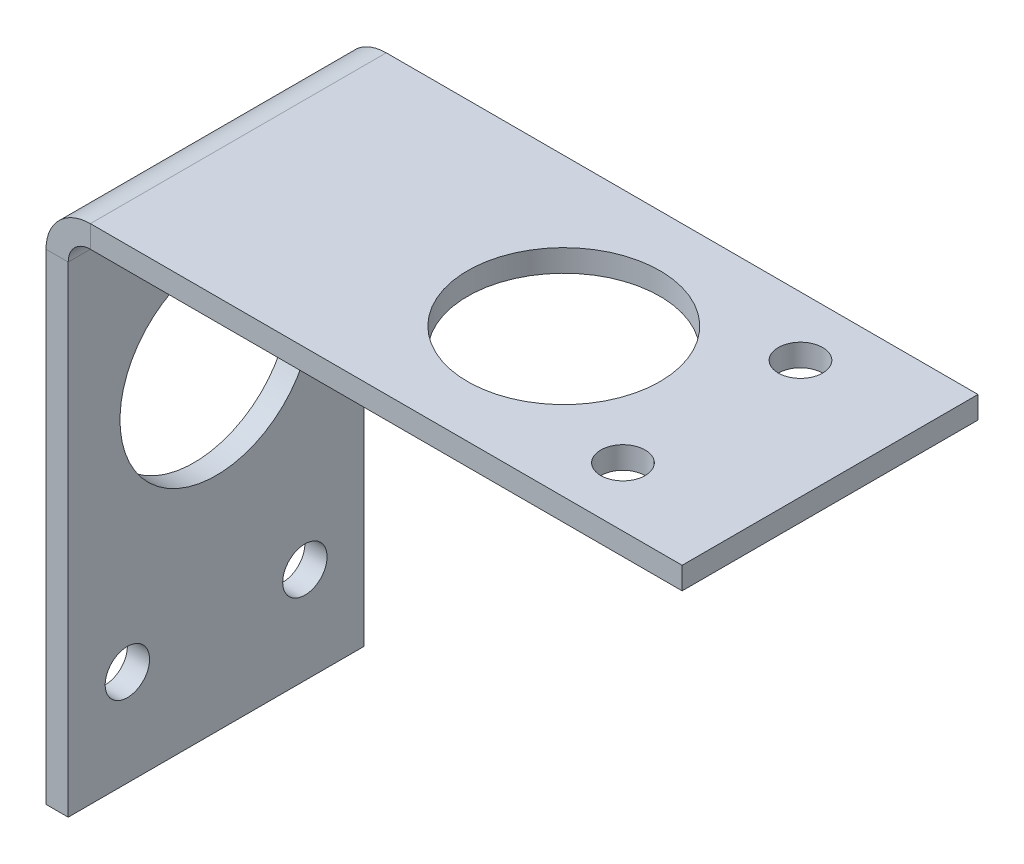
ISO-10303-21;
HEADER;
FILE_DESCRIPTION(('STEP AP214'),'2;1');
FILE_NAME('part.step','',(''),(''),'','','');
FILE_SCHEMA(('AUTOMOTIVE_DESIGN { 1 0 10303 214 1 1 1 1 }'));
ENDSEC;
DATA;
#1=APPLICATION_CONTEXT('core data for automotive mechanical design processes');
#2=APPLICATION_PROTOCOL_DEFINITION('international standard','automotive_design',2000,#1);
#3=PRODUCT_CONTEXT('',#1,'mechanical');
#4=PRODUCT('Part','Part','',(#3));
#5=PRODUCT_RELATED_PRODUCT_CATEGORY('part','',(#4));
#6=PRODUCT_DEFINITION_FORMATION('','',#4);
#7=PRODUCT_DEFINITION_CONTEXT('part definition',#1,'design');
#8=PRODUCT_DEFINITION('design','',#6,#7);
#9=PRODUCT_DEFINITION_SHAPE('','',#8);
#10=(LENGTH_UNIT() NAMED_UNIT(*) SI_UNIT(.MILLI.,.METRE.));
#11=(NAMED_UNIT(*) PLANE_ANGLE_UNIT() SI_UNIT($,.RADIAN.));
#12=(NAMED_UNIT(*) SI_UNIT($,.STERADIAN.) SOLID_ANGLE_UNIT());
#13=UNCERTAINTY_MEASURE_WITH_UNIT(LENGTH_MEASURE(1.E-05),#10,'distance_accuracy_value','');
#14=(GEOMETRIC_REPRESENTATION_CONTEXT(3) GLOBAL_UNCERTAINTY_ASSIGNED_CONTEXT((#13)) GLOBAL_UNIT_ASSIGNED_CONTEXT((#10,
#11,#12)) REPRESENTATION_CONTEXT('',''));
#15=CARTESIAN_POINT('',(0.,0.,0.));
#16=DIRECTION('',(0.,0.,1.));
#17=DIRECTION('',(1.,0.,0.));
#18=AXIS2_PLACEMENT_3D('',#15,#16,#17);
#19=CARTESIAN_POINT('',(-83.,-3.00000000000001,40.));
#20=DIRECTION('',(0.,0.,1.));
#21=DIRECTION('',(1.,0.,0.));
#22=AXIS2_PLACEMENT_3D('',#19,#20,#21);
#23=PLANE('',#22);
#24=DIRECTION('',(-1.,0.,0.));
#25=VECTOR('',#24,1.);
#26=CARTESIAN_POINT('',(-83.,-3.00000000000001,40.));
#27=LINE('',#26,#25);
#28=CARTESIAN_POINT('',(-83.,-3.00000000000001,40.));
#29=VERTEX_POINT('',#28);
#30=CARTESIAN_POINT('',(-86.,-3.00000000000001,40.));
#31=VERTEX_POINT('',#30);
#32=EDGE_CURVE('E11',#29,#31,#27,.T.);
#33=ORIENTED_EDGE('',*,*,#32,.F.);
#34=CARTESIAN_POINT('',(-80.,-3.00000000000001,40.));
#35=DIRECTION('',(0.,0.,-1.));
#36=DIRECTION('',(-1.,0.,0.));
#37=AXIS2_PLACEMENT_3D('',#34,#35,#36);
#38=CIRCLE('',#37,3.);
#39=CARTESIAN_POINT('',(-80.,0.,40.));
#40=VERTEX_POINT('',#39);
#41=EDGE_CURVE('E148',#40,#29,#38,.F.);
#42=ORIENTED_EDGE('',*,*,#41,.F.);
#43=DIRECTION('',(0.,-1.,0.));
#44=VECTOR('',#43,1.);
#45=CARTESIAN_POINT('',(-80.,2.99999999999999,40.));
#46=LINE('',#45,#44);
#47=CARTESIAN_POINT('',(-80.,2.99999999999999,40.));
#48=VERTEX_POINT('',#47);
#49=EDGE_CURVE('E54',#48,#40,#46,.T.);
#50=ORIENTED_EDGE('',*,*,#49,.F.);
#51=CARTESIAN_POINT('',(-80.,-3.00000000000001,40.));
#52=DIRECTION('',(0.,0.,1.));
#53=DIRECTION('',(1.,0.,0.));
#54=AXIS2_PLACEMENT_3D('',#51,#52,#53);
#55=CIRCLE('',#54,6.);
#56=EDGE_CURVE('E139',#48,#31,#55,.T.);
#57=ORIENTED_EDGE('',*,*,#56,.T.);
#58=EDGE_LOOP('',(#33,#42,#50,#57));
#59=FACE_BOUND('',#58,.T.);
#60=ADVANCED_FACE('F44',(#59),#23,.T.);
#61=CARTESIAN_POINT('',(-80.,2.99999999999999,40.));
#62=DIRECTION('',(0.,0.,1.));
#63=DIRECTION('',(1.,0.,0.));
#64=AXIS2_PLACEMENT_3D('',#61,#62,#63);
#65=PLANE('',#64);
#66=DIRECTION('',(0.,-1.,0.));
#67=VECTOR('',#66,1.);
#68=CARTESIAN_POINT('',(-83.,0.,40.));
#69=LINE('',#68,#67);
#70=CARTESIAN_POINT('',(-83.,-68.,40.));
#71=VERTEX_POINT('',#70);
#72=EDGE_CURVE('E250',#29,#71,#69,.T.);
#73=ORIENTED_EDGE('',*,*,#72,.F.);
#74=ORIENTED_EDGE('',*,*,#32,.T.);
#75=DIRECTION('',(0.,-1.,0.));
#76=VECTOR('',#75,1.);
#77=CARTESIAN_POINT('',(-86.,0.,40.));
#78=LINE('',#77,#76);
#79=CARTESIAN_POINT('',(-86.,-68.,40.));
#80=VERTEX_POINT('',#79);
#81=EDGE_CURVE('E103',#31,#80,#78,.T.);
#82=ORIENTED_EDGE('',*,*,#81,.T.);
#83=DIRECTION('',(-1.,0.,0.));
#84=VECTOR('',#83,1.);
#85=CARTESIAN_POINT('',(-83.,-68.,40.));
#86=LINE('',#85,#84);
#87=EDGE_CURVE('E246',#71,#80,#86,.T.);
#88=ORIENTED_EDGE('',*,*,#87,.F.);
#89=EDGE_LOOP('',(#73,#74,#82,#88));
#90=FACE_BOUND('',#89,.T.);
#91=ADVANCED_FACE('F272',(#90),#65,.T.);
#92=CARTESIAN_POINT('',(-80.,0.,0.));
#93=DIRECTION('',(0.,0.,-1.));
#94=DIRECTION('',(-1.,0.,0.));
#95=AXIS2_PLACEMENT_3D('',#92,#93,#94);
#96=PLANE('',#95);
#97=DIRECTION('',(0.,1.,0.));
#98=VECTOR('',#97,1.);
#99=CARTESIAN_POINT('',(-80.,0.,0.));
#100=LINE('',#99,#98);
#101=CARTESIAN_POINT('',(-80.,0.,0.));
#102=VERTEX_POINT('',#101);
#103=CARTESIAN_POINT('',(-80.,2.99999999999999,0.));
#104=VERTEX_POINT('',#103);
#105=EDGE_CURVE('E90',#102,#104,#100,.T.);
#106=ORIENTED_EDGE('',*,*,#105,.F.);
#107=CARTESIAN_POINT('',(-80.,-3.00000000000001,0.));
#108=DIRECTION('',(0.,0.,-1.));
#109=DIRECTION('',(-1.,0.,0.));
#110=AXIS2_PLACEMENT_3D('',#107,#108,#109);
#111=CIRCLE('',#110,3.);
#112=CARTESIAN_POINT('',(-83.,-3.00000000000001,0.));
#113=VERTEX_POINT('',#112);
#114=EDGE_CURVE('E168',#102,#113,#111,.F.);
#115=ORIENTED_EDGE('',*,*,#114,.T.);
#116=DIRECTION('',(1.,0.,0.));
#117=VECTOR('',#116,1.);
#118=CARTESIAN_POINT('',(-86.,-3.00000000000001,0.));
#119=LINE('',#118,#117);
#120=CARTESIAN_POINT('',(-86.,-3.00000000000001,0.));
#121=VERTEX_POINT('',#120);
#122=EDGE_CURVE('E97',#121,#113,#119,.T.);
#123=ORIENTED_EDGE('',*,*,#122,.F.);
#124=CARTESIAN_POINT('',(-80.,-3.00000000000001,0.));
#125=DIRECTION('',(0.,0.,1.));
#126=DIRECTION('',(1.,0.,0.));
#127=AXIS2_PLACEMENT_3D('',#124,#125,#126);
#128=CIRCLE('',#127,6.);
#129=EDGE_CURVE('E179',#104,#121,#128,.T.);
#130=ORIENTED_EDGE('',*,*,#129,.F.);
#131=EDGE_LOOP('',(#106,#115,#123,#130));
#132=FACE_BOUND('',#131,.T.);
#133=ADVANCED_FACE('F270',(#132),#96,.T.);
#134=CARTESIAN_POINT('',(-86.,-3.00000000000001,0.));
#135=DIRECTION('',(0.,0.,-1.));
#136=DIRECTION('',(-1.,0.,0.));
#137=AXIS2_PLACEMENT_3D('',#134,#135,#136);
#138=PLANE('',#137);
#139=DIRECTION('',(-1.,0.,0.));
#140=VECTOR('',#139,1.);
#141=CARTESIAN_POINT('',(0.,0.,0.));
#142=LINE('',#141,#140);
#143=CARTESIAN_POINT('',(0.,0.,0.));
#144=VERTEX_POINT('',#143);
#145=EDGE_CURVE('E171',#144,#102,#142,.T.);
#146=ORIENTED_EDGE('',*,*,#145,.T.);
#147=ORIENTED_EDGE('',*,*,#105,.T.);
#148=DIRECTION('',(-1.,0.,0.));
#149=VECTOR('',#148,1.);
#150=CARTESIAN_POINT('',(0.,3.,0.));
#151=LINE('',#150,#149);
#152=CARTESIAN_POINT('',(0.,3.,0.));
#153=VERTEX_POINT('',#152);
#154=EDGE_CURVE('E176',#153,#104,#151,.T.);
#155=ORIENTED_EDGE('',*,*,#154,.F.);
#156=DIRECTION('',(0.,-1.,0.));
#157=VECTOR('',#156,1.);
#158=CARTESIAN_POINT('',(0.,3.,0.));
#159=LINE('',#158,#157);
#160=EDGE_CURVE('E125',#153,#144,#159,.T.);
#161=ORIENTED_EDGE('',*,*,#160,.T.);
#162=EDGE_LOOP('',(#146,#147,#155,#161));
#163=FACE_BOUND('',#162,.T.);
#164=ADVANCED_FACE('F266',(#163),#138,.T.);
#165=CARTESIAN_POINT('',(-86.,0.,40.));
#166=DIRECTION('',(1.,0.,0.));
#167=DIRECTION('',(0.,1.,0.));
#168=AXIS2_PLACEMENT_3D('',#165,#166,#167);
#169=PLANE('',#168);
#170=CARTESIAN_POINT('',(-86.,-55.,32.));
#171=DIRECTION('',(1.,0.,0.));
#172=DIRECTION('',(0.,1.,0.));
#173=AXIS2_PLACEMENT_3D('',#170,#171,#172);
#174=CIRCLE('',#173,3.);
#175=CARTESIAN_POINT('',(-86.,-52.,32.));
#176=VERTEX_POINT('',#175);
#177=EDGE_CURVE('E225',#176,#176,#174,.T.);
#178=ORIENTED_EDGE('',*,*,#177,.T.);
#179=EDGE_LOOP('',(#178));
#180=FACE_BOUND('',#179,.T.);
#181=CARTESIAN_POINT('',(-86.,-55.,8.));
#182=DIRECTION('',(1.,0.,0.));
#183=DIRECTION('',(0.,1.,0.));
#184=AXIS2_PLACEMENT_3D('',#181,#182,#183);
#185=CIRCLE('',#184,3.);
#186=CARTESIAN_POINT('',(-86.,-52.,8.));
#187=VERTEX_POINT('',#186);
#188=EDGE_CURVE('E526',#187,#187,#185,.T.);
#189=ORIENTED_EDGE('',*,*,#188,.T.);
#190=EDGE_LOOP('',(#189));
#191=FACE_BOUND('',#190,.T.);
#192=CARTESIAN_POINT('',(-86.,-25.,20.));
#193=DIRECTION('',(1.,0.,0.));
#194=DIRECTION('',(0.,1.,0.));
#195=AXIS2_PLACEMENT_3D('',#192,#193,#194);
#196=CIRCLE('',#195,13.);
#197=CARTESIAN_POINT('',(-86.,-12.,20.));
#198=VERTEX_POINT('',#197);
#199=EDGE_CURVE('E160',#198,#198,#196,.T.);
#200=ORIENTED_EDGE('',*,*,#199,.T.);
#201=EDGE_LOOP('',(#200));
#202=FACE_BOUND('',#201,.T.);
#203=DIRECTION('',(0.,-1.,0.));
#204=VECTOR('',#203,1.);
#205=CARTESIAN_POINT('',(-86.,0.,0.));
#206=LINE('',#205,#204);
#207=CARTESIAN_POINT('',(-86.,-68.,0.));
#208=VERTEX_POINT('',#207);
#209=EDGE_CURVE('E155',#121,#208,#206,.T.);
#210=ORIENTED_EDGE('',*,*,#209,.T.);
#211=DIRECTION('',(0.,0.,-1.));
#212=VECTOR('',#211,1.);
#213=CARTESIAN_POINT('',(-86.,-68.,40.));
#214=LINE('',#213,#212);
#215=EDGE_CURVE('E200',#80,#208,#214,.T.);
#216=ORIENTED_EDGE('',*,*,#215,.F.);
#217=ORIENTED_EDGE('',*,*,#81,.F.);
#218=DIRECTION('',(0.,0.,-1.));
#219=VECTOR('',#218,1.);
#220=CARTESIAN_POINT('',(-86.,-3.00000000000001,40.));
#221=LINE('',#220,#219);
#222=EDGE_CURVE('E154',#31,#121,#221,.T.);
#223=ORIENTED_EDGE('',*,*,#222,.T.);
#224=EDGE_LOOP('',(#210,#216,#217,#223));
#225=FACE_BOUND('',#224,.T.);
#226=ADVANCED_FACE('F278',(#180,#191,#202,#225),#169,.F.);
#227=CARTESIAN_POINT('',(-83.,-68.,40.));
#228=DIRECTION('',(0.,-1.,0.));
#229=DIRECTION('',(0.,0.,-1.));
#230=AXIS2_PLACEMENT_3D('',#227,#228,#229);
#231=PLANE('',#230);
#232=DIRECTION('',(-1.,0.,0.));
#233=VECTOR('',#232,1.);
#234=CARTESIAN_POINT('',(-83.,-68.,0.));
#235=LINE('',#234,#233);
#236=CARTESIAN_POINT('',(-83.,-68.,0.));
#237=VERTEX_POINT('',#236);
#238=EDGE_CURVE('E159',#237,#208,#235,.T.);
#239=ORIENTED_EDGE('',*,*,#238,.F.);
#240=DIRECTION('',(0.,0.,-1.));
#241=VECTOR('',#240,1.);
#242=CARTESIAN_POINT('',(-83.,-68.,40.));
#243=LINE('',#242,#241);
#244=EDGE_CURVE('E197',#71,#237,#243,.T.);
#245=ORIENTED_EDGE('',*,*,#244,.F.);
#246=ORIENTED_EDGE('',*,*,#87,.T.);
#247=ORIENTED_EDGE('',*,*,#215,.T.);
#248=EDGE_LOOP('',(#239,#245,#246,#247));
#249=FACE_BOUND('',#248,.T.);
#250=ADVANCED_FACE('F307',(#249),#231,.T.);
#251=CARTESIAN_POINT('',(-83.,0.,40.));
#252=DIRECTION('',(1.,0.,0.));
#253=DIRECTION('',(0.,1.,0.));
#254=AXIS2_PLACEMENT_3D('',#251,#252,#253);
#255=PLANE('',#254);
#256=CARTESIAN_POINT('',(-83.,-55.,32.));
#257=DIRECTION('',(1.,0.,0.));
#258=DIRECTION('',(0.,1.,0.));
#259=AXIS2_PLACEMENT_3D('',#256,#257,#258);
#260=CIRCLE('',#259,3.);
#261=CARTESIAN_POINT('',(-83.,-52.,32.));
#262=VERTEX_POINT('',#261);
#263=EDGE_CURVE('E522',#262,#262,#260,.T.);
#264=ORIENTED_EDGE('',*,*,#263,.F.);
#265=EDGE_LOOP('',(#264));
#266=FACE_BOUND('',#265,.T.);
#267=CARTESIAN_POINT('',(-83.,-55.,8.));
#268=DIRECTION('',(1.,0.,0.));
#269=DIRECTION('',(0.,1.,0.));
#270=AXIS2_PLACEMENT_3D('',#267,#268,#269);
#271=CIRCLE('',#270,3.);
#272=CARTESIAN_POINT('',(-83.,-52.,8.));
#273=VERTEX_POINT('',#272);
#274=EDGE_CURVE('E532',#273,#273,#271,.T.);
#275=ORIENTED_EDGE('',*,*,#274,.F.);
#276=EDGE_LOOP('',(#275));
#277=FACE_BOUND('',#276,.T.);
#278=CARTESIAN_POINT('',(-83.,-25.,20.));
#279=DIRECTION('',(1.,0.,0.));
#280=DIRECTION('',(0.,1.,0.));
#281=AXIS2_PLACEMENT_3D('',#278,#279,#280);
#282=CIRCLE('',#281,13.);
#283=CARTESIAN_POINT('',(-83.,-12.,20.));
#284=VERTEX_POINT('',#283);
#285=EDGE_CURVE('E234',#284,#284,#282,.T.);
#286=ORIENTED_EDGE('',*,*,#285,.F.);
#287=EDGE_LOOP('',(#286));
#288=FACE_BOUND('',#287,.T.);
#289=DIRECTION('',(0.,-1.,0.));
#290=VECTOR('',#289,1.);
#291=CARTESIAN_POINT('',(-83.,0.,0.));
#292=LINE('',#291,#290);
#293=EDGE_CURVE('E164',#113,#237,#292,.T.);
#294=ORIENTED_EDGE('',*,*,#293,.F.);
#295=DIRECTION('',(0.,0.,-1.));
#296=VECTOR('',#295,1.);
#297=CARTESIAN_POINT('',(-83.,-3.00000000000001,40.));
#298=LINE('',#297,#296);
#299=EDGE_CURVE('E193',#29,#113,#298,.T.);
#300=ORIENTED_EDGE('',*,*,#299,.F.);
#301=ORIENTED_EDGE('',*,*,#72,.T.);
#302=ORIENTED_EDGE('',*,*,#244,.T.);
#303=EDGE_LOOP('',(#294,#300,#301,#302));
#304=FACE_BOUND('',#303,.T.);
#305=ADVANCED_FACE('F312',(#266,#277,#288,#304),#255,.T.);
#306=CARTESIAN_POINT('',(-80.,-3.00000000000001,40.));
#307=DIRECTION('',(0.,0.,-1.));
#308=DIRECTION('',(-1.,0.,0.));
#309=AXIS2_PLACEMENT_3D('',#306,#307,#308);
#310=CYLINDRICAL_SURFACE('',#309,3.);
#311=ORIENTED_EDGE('',*,*,#114,.F.);
#312=DIRECTION('',(0.,0.,-1.));
#313=VECTOR('',#312,1.);
#314=CARTESIAN_POINT('',(-80.,0.,40.));
#315=LINE('',#314,#313);
#316=EDGE_CURVE('E189',#40,#102,#315,.T.);
#317=ORIENTED_EDGE('',*,*,#316,.F.);
#318=ORIENTED_EDGE('',*,*,#41,.T.);
#319=ORIENTED_EDGE('',*,*,#299,.T.);
#320=EDGE_LOOP('',(#311,#317,#318,#319));
#321=FACE_BOUND('',#320,.T.);
#322=ADVANCED_FACE('F259',(#321),#310,.F.);
#323=CARTESIAN_POINT('',(0.,0.,40.));
#324=DIRECTION('',(0.,-1.,0.));
#325=DIRECTION('',(1.,0.,0.));
#326=AXIS2_PLACEMENT_3D('',#323,#324,#325);
#327=PLANE('',#326);
#328=CARTESIAN_POINT('',(-16.,0.,32.));
#329=DIRECTION('',(0.,-1.,0.));
#330=DIRECTION('',(1.,0.,0.));
#331=AXIS2_PLACEMENT_3D('',#328,#329,#330);
#332=CIRCLE('',#331,3.);
#333=CARTESIAN_POINT('',(-13.,0.,32.));
#334=VERTEX_POINT('',#333);
#335=EDGE_CURVE('E211',#334,#334,#332,.T.);
#336=ORIENTED_EDGE('',*,*,#335,.F.);
#337=EDGE_LOOP('',(#336));
#338=FACE_BOUND('',#337,.T.);
#339=CARTESIAN_POINT('',(-16.,0.,8.00000000000002));
#340=DIRECTION('',(0.,-1.,0.));
#341=DIRECTION('',(1.,0.,0.));
#342=AXIS2_PLACEMENT_3D('',#339,#340,#341);
#343=CIRCLE('',#342,3.);
#344=CARTESIAN_POINT('',(-13.,0.,8.00000000000002));
#345=VERTEX_POINT('',#344);
#346=EDGE_CURVE('E219',#345,#345,#343,.T.);
#347=ORIENTED_EDGE('',*,*,#346,.F.);
#348=EDGE_LOOP('',(#347));
#349=FACE_BOUND('',#348,.T.);
#350=CARTESIAN_POINT('',(-36.,0.,20.));
#351=DIRECTION('',(0.,-1.,0.));
#352=DIRECTION('',(1.,0.,0.));
#353=AXIS2_PLACEMENT_3D('',#350,#351,#352);
#354=CIRCLE('',#353,13.);
#355=CARTESIAN_POINT('',(-23.,0.,20.));
#356=VERTEX_POINT('',#355);
#357=EDGE_CURVE('E217',#356,#356,#354,.T.);
#358=ORIENTED_EDGE('',*,*,#357,.F.);
#359=EDGE_LOOP('',(#358));
#360=FACE_BOUND('',#359,.T.);
#361=ORIENTED_EDGE('',*,*,#145,.F.);
#362=DIRECTION('',(0.,0.,-1.));
#363=VECTOR('',#362,1.);
#364=CARTESIAN_POINT('',(0.,0.,40.));
#365=LINE('',#364,#363);
#366=CARTESIAN_POINT('',(0.,0.,40.));
#367=VERTEX_POINT('',#366);
#368=EDGE_CURVE('E128',#367,#144,#365,.T.);
#369=ORIENTED_EDGE('',*,*,#368,.F.);
#370=DIRECTION('',(-1.,0.,0.));
#371=VECTOR('',#370,1.);
#372=CARTESIAN_POINT('',(0.,0.,40.));
#373=LINE('',#372,#371);
#374=EDGE_CURVE('E144',#367,#40,#373,.T.);
#375=ORIENTED_EDGE('',*,*,#374,.T.);
#376=ORIENTED_EDGE('',*,*,#316,.T.);
#377=EDGE_LOOP('',(#361,#369,#375,#376));
#378=FACE_BOUND('',#377,.T.);
#379=ADVANCED_FACE('F265',(#338,#349,#360,#378),#327,.T.);
#380=CARTESIAN_POINT('',(0.,3.,40.));
#381=DIRECTION('',(1.,0.,0.));
#382=DIRECTION('',(0.,1.,0.));
#383=AXIS2_PLACEMENT_3D('',#380,#381,#382);
#384=PLANE('',#383);
#385=ORIENTED_EDGE('',*,*,#160,.F.);
#386=DIRECTION('',(0.,0.,-1.));
#387=VECTOR('',#386,1.);
#388=CARTESIAN_POINT('',(0.,3.,40.));
#389=LINE('',#388,#387);
#390=CARTESIAN_POINT('',(0.,3.,40.));
#391=VERTEX_POINT('',#390);
#392=EDGE_CURVE('E119',#391,#153,#389,.T.);
#393=ORIENTED_EDGE('',*,*,#392,.F.);
#394=DIRECTION('',(0.,-1.,0.));
#395=VECTOR('',#394,1.);
#396=CARTESIAN_POINT('',(0.,3.,40.));
#397=LINE('',#396,#395);
#398=EDGE_CURVE('E123',#391,#367,#397,.T.);
#399=ORIENTED_EDGE('',*,*,#398,.T.);
#400=ORIENTED_EDGE('',*,*,#368,.T.);
#401=EDGE_LOOP('',(#385,#393,#399,#400));
#402=FACE_BOUND('',#401,.T.);
#403=ADVANCED_FACE('F121',(#402),#384,.T.);
#404=CARTESIAN_POINT('',(0.,3.,40.));
#405=DIRECTION('',(0.,-1.,0.));
#406=DIRECTION('',(1.,0.,0.));
#407=AXIS2_PLACEMENT_3D('',#404,#405,#406);
#408=PLANE('',#407);
#409=CARTESIAN_POINT('',(-16.,3.,32.));
#410=DIRECTION('',(0.,-1.,0.));
#411=DIRECTION('',(1.,0.,0.));
#412=AXIS2_PLACEMENT_3D('',#409,#410,#411);
#413=CIRCLE('',#412,3.);
#414=CARTESIAN_POINT('',(-13.,3.,32.));
#415=VERTEX_POINT('',#414);
#416=EDGE_CURVE('E47',#415,#415,#413,.T.);
#417=ORIENTED_EDGE('',*,*,#416,.T.);
#418=EDGE_LOOP('',(#417));
#419=FACE_BOUND('',#418,.T.);
#420=CARTESIAN_POINT('',(-16.,3.,8.00000000000002));
#421=DIRECTION('',(0.,-1.,0.));
#422=DIRECTION('',(1.,0.,0.));
#423=AXIS2_PLACEMENT_3D('',#420,#421,#422);
#424=CIRCLE('',#423,3.);
#425=CARTESIAN_POINT('',(-13.,3.,8.00000000000002));
#426=VERTEX_POINT('',#425);
#427=EDGE_CURVE('E208',#426,#426,#424,.T.);
#428=ORIENTED_EDGE('',*,*,#427,.T.);
#429=EDGE_LOOP('',(#428));
#430=FACE_BOUND('',#429,.T.);
#431=CARTESIAN_POINT('',(-36.,3.00000000000001,20.));
#432=DIRECTION('',(0.,-1.,0.));
#433=DIRECTION('',(1.,0.,0.));
#434=AXIS2_PLACEMENT_3D('',#431,#432,#433);
#435=CIRCLE('',#434,13.);
#436=CARTESIAN_POINT('',(-23.,3.00000000000001,20.));
#437=VERTEX_POINT('',#436);
#438=EDGE_CURVE('E230',#437,#437,#435,.T.);
#439=ORIENTED_EDGE('',*,*,#438,.T.);
#440=EDGE_LOOP('',(#439));
#441=FACE_BOUND('',#440,.T.);
#442=ORIENTED_EDGE('',*,*,#154,.T.);
#443=DIRECTION('',(0.,0.,-1.));
#444=VECTOR('',#443,1.);
#445=CARTESIAN_POINT('',(-80.,2.99999999999999,40.));
#446=LINE('',#445,#444);
#447=EDGE_CURVE('E129',#48,#104,#446,.T.);
#448=ORIENTED_EDGE('',*,*,#447,.F.);
#449=DIRECTION('',(-1.,0.,0.));
#450=VECTOR('',#449,1.);
#451=CARTESIAN_POINT('',(0.,3.,40.));
#452=LINE('',#451,#450);
#453=EDGE_CURVE('E133',#391,#48,#452,.T.);
#454=ORIENTED_EDGE('',*,*,#453,.F.);
#455=ORIENTED_EDGE('',*,*,#392,.T.);
#456=EDGE_LOOP('',(#442,#448,#454,#455));
#457=FACE_BOUND('',#456,.T.);
#458=ADVANCED_FACE('F134',(#419,#430,#441,#457),#408,.F.);
#459=CARTESIAN_POINT('',(-80.,-3.00000000000001,40.));
#460=DIRECTION('',(0.,0.,-1.));
#461=DIRECTION('',(-1.,0.,0.));
#462=AXIS2_PLACEMENT_3D('',#459,#460,#461);
#463=CYLINDRICAL_SURFACE('',#462,6.);
#464=ORIENTED_EDGE('',*,*,#129,.T.);
#465=ORIENTED_EDGE('',*,*,#222,.F.);
#466=ORIENTED_EDGE('',*,*,#56,.F.);
#467=ORIENTED_EDGE('',*,*,#447,.T.);
#468=EDGE_LOOP('',(#464,#465,#466,#467));
#469=FACE_BOUND('',#468,.T.);
#470=ADVANCED_FACE('F268',(#469),#463,.T.);
#471=CARTESIAN_POINT('',(-80.,-3.00000000000001,40.));
#472=DIRECTION('',(0.,0.,-1.));
#473=DIRECTION('',(-1.,0.,0.));
#474=AXIS2_PLACEMENT_3D('',#471,#472,#473);
#475=PLANE('',#474);
#476=ORIENTED_EDGE('',*,*,#453,.T.);
#477=ORIENTED_EDGE('',*,*,#49,.T.);
#478=ORIENTED_EDGE('',*,*,#374,.F.);
#479=ORIENTED_EDGE('',*,*,#398,.F.);
#480=EDGE_LOOP('',(#476,#477,#478,#479));
#481=FACE_BOUND('',#480,.T.);
#482=ADVANCED_FACE('F142',(#481),#475,.F.);
#483=CARTESIAN_POINT('',(-80.,-3.00000000000001,0.));
#484=DIRECTION('',(0.,0.,-1.));
#485=DIRECTION('',(-1.,0.,0.));
#486=AXIS2_PLACEMENT_3D('',#483,#484,#485);
#487=PLANE('',#486);
#488=ORIENTED_EDGE('',*,*,#209,.F.);
#489=ORIENTED_EDGE('',*,*,#122,.T.);
#490=ORIENTED_EDGE('',*,*,#293,.T.);
#491=ORIENTED_EDGE('',*,*,#238,.T.);
#492=EDGE_LOOP('',(#488,#489,#490,#491));
#493=FACE_BOUND('',#492,.T.);
#494=ADVANCED_FACE('F356',(#493),#487,.T.);
#495=CARTESIAN_POINT('',(-86.,-25.,20.));
#496=DIRECTION('',(1.,0.,0.));
#497=DIRECTION('',(0.,1.,0.));
#498=AXIS2_PLACEMENT_3D('',#495,#496,#497);
#499=CYLINDRICAL_SURFACE('',#498,13.);
#500=ORIENTED_EDGE('',*,*,#199,.F.);
#501=EDGE_LOOP('',(#500));
#502=FACE_BOUND('',#501,.T.);
#503=ORIENTED_EDGE('',*,*,#285,.T.);
#504=EDGE_LOOP('',(#503));
#505=FACE_BOUND('',#504,.T.);
#506=ADVANCED_FACE('F366',(#502,#505),#499,.F.);
#507=CARTESIAN_POINT('',(-36.,3.00000000000001,20.));
#508=DIRECTION('',(0.,-1.,0.));
#509=DIRECTION('',(1.,0.,0.));
#510=AXIS2_PLACEMENT_3D('',#507,#508,#509);
#511=CYLINDRICAL_SURFACE('',#510,13.);
#512=ORIENTED_EDGE('',*,*,#438,.F.);
#513=EDGE_LOOP('',(#512));
#514=FACE_BOUND('',#513,.T.);
#515=ORIENTED_EDGE('',*,*,#357,.T.);
#516=EDGE_LOOP('',(#515));
#517=FACE_BOUND('',#516,.T.);
#518=ADVANCED_FACE('F377',(#514,#517),#511,.F.);
#519=CARTESIAN_POINT('',(-16.,10.,8.00000000000002));
#520=DIRECTION('',(0.,-1.,0.));
#521=DIRECTION('',(1.,0.,0.));
#522=AXIS2_PLACEMENT_3D('',#519,#520,#521);
#523=CYLINDRICAL_SURFACE('',#522,3.);
#524=ORIENTED_EDGE('',*,*,#346,.T.);
#525=EDGE_LOOP('',(#524));
#526=FACE_BOUND('',#525,.T.);
#527=ORIENTED_EDGE('',*,*,#427,.F.);
#528=EDGE_LOOP('',(#527));
#529=FACE_BOUND('',#528,.T.);
#530=ADVANCED_FACE('F388',(#526,#529),#523,.F.);
#531=CARTESIAN_POINT('',(-16.,10.,32.));
#532=DIRECTION('',(0.,-1.,0.));
#533=DIRECTION('',(1.,0.,0.));
#534=AXIS2_PLACEMENT_3D('',#531,#532,#533);
#535=CYLINDRICAL_SURFACE('',#534,3.);
#536=ORIENTED_EDGE('',*,*,#335,.T.);
#537=EDGE_LOOP('',(#536));
#538=FACE_BOUND('',#537,.T.);
#539=ORIENTED_EDGE('',*,*,#416,.F.);
#540=EDGE_LOOP('',(#539));
#541=FACE_BOUND('',#540,.T.);
#542=ADVANCED_FACE('F409',(#538,#541),#535,.F.);
#543=CARTESIAN_POINT('',(-93.,-55.,8.));
#544=DIRECTION('',(1.,0.,0.));
#545=DIRECTION('',(0.,1.,0.));
#546=AXIS2_PLACEMENT_3D('',#543,#544,#545);
#547=CYLINDRICAL_SURFACE('',#546,3.);
#548=ORIENTED_EDGE('',*,*,#274,.T.);
#549=EDGE_LOOP('',(#548));
#550=FACE_BOUND('',#549,.T.);
#551=ORIENTED_EDGE('',*,*,#188,.F.);
#552=EDGE_LOOP('',(#551));
#553=FACE_BOUND('',#552,.T.);
#554=ADVANCED_FACE('F420',(#550,#553),#547,.F.);
#555=CARTESIAN_POINT('',(-93.,-55.,32.));
#556=DIRECTION('',(1.,0.,0.));
#557=DIRECTION('',(0.,1.,0.));
#558=AXIS2_PLACEMENT_3D('',#555,#556,#557);
#559=CYLINDRICAL_SURFACE('',#558,3.);
#560=ORIENTED_EDGE('',*,*,#263,.T.);
#561=EDGE_LOOP('',(#560));
#562=FACE_BOUND('',#561,.T.);
#563=ORIENTED_EDGE('',*,*,#177,.F.);
#564=EDGE_LOOP('',(#563));
#565=FACE_BOUND('',#564,.T.);
#566=ADVANCED_FACE('F440',(#562,#565),#559,.F.);
#567=CLOSED_SHELL('',(#60,#91,#133,#164,#226,#250,#305,#322,#379,#403,#458,#470,#482,#494,#506,
#518,#530,#542,#554,#566));
#568=MANIFOLD_SOLID_BREP('B2',#567);
#569=ADVANCED_BREP_SHAPE_REPRESENTATION('',(#18,#568),#14);
#570=SHAPE_DEFINITION_REPRESENTATION(#9,#569);
ENDSEC;
END-ISO-10303-21;
